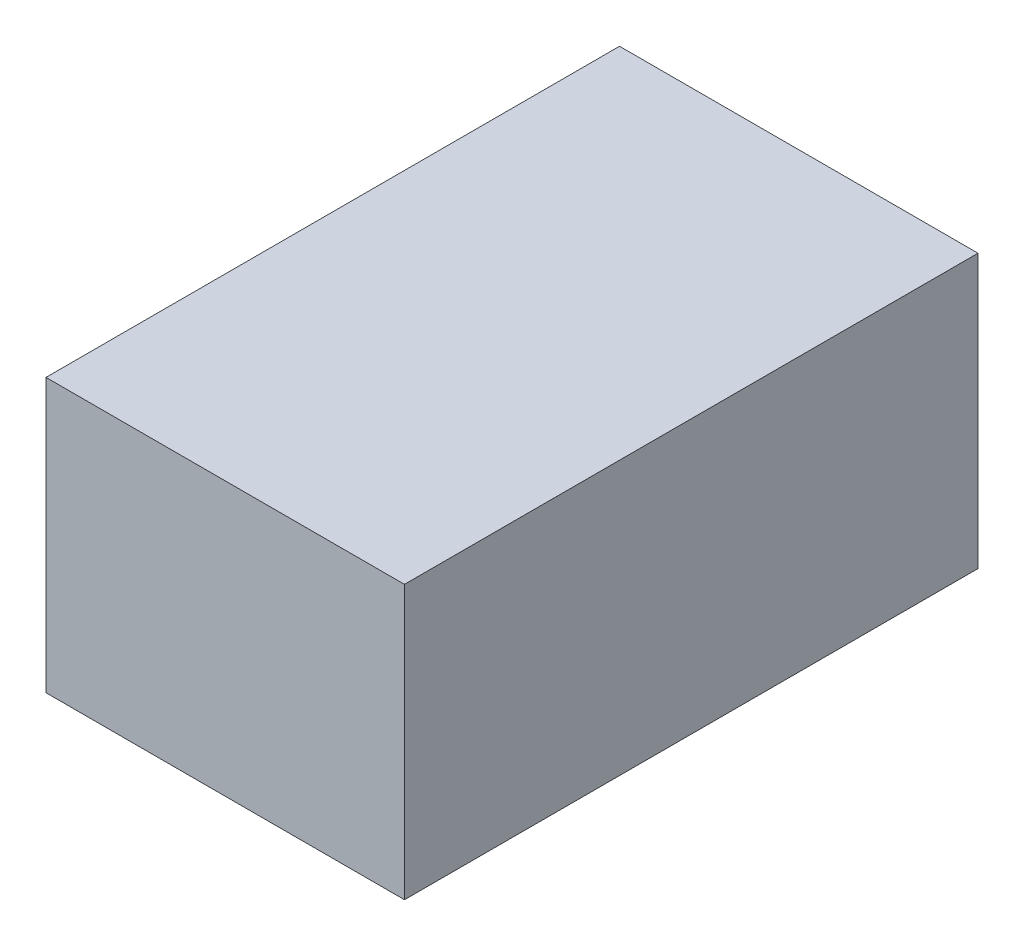
ISO-10303-21;
HEADER;
FILE_DESCRIPTION(('STEP AP214'),'2;1');
FILE_NAME('part.step','',(''),(''),'','','');
FILE_SCHEMA(('AUTOMOTIVE_DESIGN { 1 0 10303 214 1 1 1 1 }'));
ENDSEC;
DATA;
#1=APPLICATION_CONTEXT('core data for automotive mechanical design processes');
#2=APPLICATION_PROTOCOL_DEFINITION('international standard','automotive_design',2000,#1);
#3=PRODUCT_CONTEXT('',#1,'mechanical');
#4=PRODUCT('Part','Part','',(#3));
#5=PRODUCT_RELATED_PRODUCT_CATEGORY('part','',(#4));
#6=PRODUCT_DEFINITION_FORMATION('','',#4);
#7=PRODUCT_DEFINITION_CONTEXT('part definition',#1,'design');
#8=PRODUCT_DEFINITION('design','',#6,#7);
#9=PRODUCT_DEFINITION_SHAPE('','',#8);
#10=(LENGTH_UNIT() NAMED_UNIT(*) SI_UNIT(.MILLI.,.METRE.));
#11=(NAMED_UNIT(*) PLANE_ANGLE_UNIT() SI_UNIT($,.RADIAN.));
#12=(NAMED_UNIT(*) SI_UNIT($,.STERADIAN.) SOLID_ANGLE_UNIT());
#13=UNCERTAINTY_MEASURE_WITH_UNIT(LENGTH_MEASURE(1.E-05),#10,'distance_accuracy_value','');
#14=(GEOMETRIC_REPRESENTATION_CONTEXT(3) GLOBAL_UNCERTAINTY_ASSIGNED_CONTEXT((#13)) GLOBAL_UNIT_ASSIGNED_CONTEXT((#10,
#11,#12)) REPRESENTATION_CONTEXT('',''));
#15=CARTESIAN_POINT('',(0.,0.,0.));
#16=DIRECTION('',(0.,0.,1.));
#17=DIRECTION('',(1.,0.,0.));
#18=AXIS2_PLACEMENT_3D('',#15,#16,#17);
#19=CARTESIAN_POINT('',(0.,7.62,0.));
#20=DIRECTION('',(1.,0.,0.));
#21=DIRECTION('',(0.,0.,-1.));
#22=AXIS2_PLACEMENT_3D('',#19,#20,#21);
#23=PLANE('',#22);
#24=DIRECTION('',(0.,0.,1.));
#25=VECTOR('',#24,1.);
#26=CARTESIAN_POINT('',(0.,0.,0.));
#27=LINE('',#26,#25);
#28=CARTESIAN_POINT('',(0.,0.,-16.));
#29=VERTEX_POINT('',#28);
#30=CARTESIAN_POINT('',(0.,0.,0.));
#31=VERTEX_POINT('',#30);
#32=EDGE_CURVE('E111',#29,#31,#27,.T.);
#33=ORIENTED_EDGE('',*,*,#32,.T.);
#34=DIRECTION('',(0.,-1.,0.));
#35=VECTOR('',#34,1.);
#36=CARTESIAN_POINT('',(0.,7.62,0.));
#37=LINE('',#36,#35);
#38=CARTESIAN_POINT('',(0.,7.62,0.));
#39=VERTEX_POINT('',#38);
#40=EDGE_CURVE('E11',#39,#31,#37,.T.);
#41=ORIENTED_EDGE('',*,*,#40,.F.);
#42=DIRECTION('',(0.,0.,1.));
#43=VECTOR('',#42,1.);
#44=CARTESIAN_POINT('',(0.,7.62,0.));
#45=LINE('',#44,#43);
#46=CARTESIAN_POINT('',(0.,7.62,-16.));
#47=VERTEX_POINT('',#46);
#48=EDGE_CURVE('E95',#47,#39,#45,.T.);
#49=ORIENTED_EDGE('',*,*,#48,.F.);
#50=DIRECTION('',(0.,-1.,0.));
#51=VECTOR('',#50,1.);
#52=CARTESIAN_POINT('',(0.,7.62,-16.));
#53=LINE('',#52,#51);
#54=EDGE_CURVE('E107',#47,#29,#53,.T.);
#55=ORIENTED_EDGE('',*,*,#54,.T.);
#56=EDGE_LOOP('',(#33,#41,#49,#55));
#57=FACE_BOUND('',#56,.T.);
#58=ADVANCED_FACE('F43',(#57),#23,.F.);
#59=CARTESIAN_POINT('',(0.,7.62,0.));
#60=DIRECTION('',(0.,0.,-1.));
#61=DIRECTION('',(-1.,0.,0.));
#62=AXIS2_PLACEMENT_3D('',#59,#60,#61);
#63=PLANE('',#62);
#64=DIRECTION('',(1.,0.,0.));
#65=VECTOR('',#64,1.);
#66=CARTESIAN_POINT('',(0.,0.,0.));
#67=LINE('',#66,#65);
#68=CARTESIAN_POINT('',(10.,0.,0.));
#69=VERTEX_POINT('',#68);
#70=EDGE_CURVE('E100',#31,#69,#67,.T.);
#71=ORIENTED_EDGE('',*,*,#70,.T.);
#72=DIRECTION('',(0.,-1.,0.));
#73=VECTOR('',#72,1.);
#74=CARTESIAN_POINT('',(10.,7.62,0.));
#75=LINE('',#74,#73);
#76=CARTESIAN_POINT('',(10.,7.62,0.));
#77=VERTEX_POINT('',#76);
#78=EDGE_CURVE('E52',#77,#69,#75,.T.);
#79=ORIENTED_EDGE('',*,*,#78,.F.);
#80=DIRECTION('',(1.,0.,0.));
#81=VECTOR('',#80,1.);
#82=CARTESIAN_POINT('',(0.,7.62,0.));
#83=LINE('',#82,#81);
#84=EDGE_CURVE('E90',#39,#77,#83,.T.);
#85=ORIENTED_EDGE('',*,*,#84,.F.);
#86=ORIENTED_EDGE('',*,*,#40,.T.);
#87=EDGE_LOOP('',(#71,#79,#85,#86));
#88=FACE_BOUND('',#87,.T.);
#89=ADVANCED_FACE('F99',(#88),#63,.F.);
#90=CARTESIAN_POINT('',(10.,7.62,0.));
#91=DIRECTION('',(-1.,0.,0.));
#92=DIRECTION('',(0.,0.,1.));
#93=AXIS2_PLACEMENT_3D('',#90,#91,#92);
#94=PLANE('',#93);
#95=DIRECTION('',(0.,0.,-1.));
#96=VECTOR('',#95,1.);
#97=CARTESIAN_POINT('',(10.,0.,0.));
#98=LINE('',#97,#96);
#99=CARTESIAN_POINT('',(10.,0.,-16.));
#100=VERTEX_POINT('',#99);
#101=EDGE_CURVE('E77',#69,#100,#98,.T.);
#102=ORIENTED_EDGE('',*,*,#101,.T.);
#103=DIRECTION('',(0.,-1.,0.));
#104=VECTOR('',#103,1.);
#105=CARTESIAN_POINT('',(10.,7.62,-16.));
#106=LINE('',#105,#104);
#107=CARTESIAN_POINT('',(10.,7.62,-16.));
#108=VERTEX_POINT('',#107);
#109=EDGE_CURVE('E102',#108,#100,#106,.T.);
#110=ORIENTED_EDGE('',*,*,#109,.F.);
#111=DIRECTION('',(0.,0.,-1.));
#112=VECTOR('',#111,1.);
#113=CARTESIAN_POINT('',(10.,7.62,0.));
#114=LINE('',#113,#112);
#115=EDGE_CURVE('E93',#77,#108,#114,.T.);
#116=ORIENTED_EDGE('',*,*,#115,.F.);
#117=ORIENTED_EDGE('',*,*,#78,.T.);
#118=EDGE_LOOP('',(#102,#110,#116,#117));
#119=FACE_BOUND('',#118,.T.);
#120=ADVANCED_FACE('F103',(#119),#94,.F.);
#121=CARTESIAN_POINT('',(0.,7.62,-16.));
#122=DIRECTION('',(0.,0.,1.));
#123=DIRECTION('',(1.,0.,0.));
#124=AXIS2_PLACEMENT_3D('',#121,#122,#123);
#125=PLANE('',#124);
#126=DIRECTION('',(-1.,0.,0.));
#127=VECTOR('',#126,1.);
#128=CARTESIAN_POINT('',(0.,0.,-16.));
#129=LINE('',#128,#127);
#130=EDGE_CURVE('E83',#100,#29,#129,.T.);
#131=ORIENTED_EDGE('',*,*,#130,.T.);
#132=ORIENTED_EDGE('',*,*,#54,.F.);
#133=DIRECTION('',(-1.,0.,0.));
#134=VECTOR('',#133,1.);
#135=CARTESIAN_POINT('',(0.,7.62,-16.));
#136=LINE('',#135,#134);
#137=EDGE_CURVE('E60',#108,#47,#136,.T.);
#138=ORIENTED_EDGE('',*,*,#137,.F.);
#139=ORIENTED_EDGE('',*,*,#109,.T.);
#140=EDGE_LOOP('',(#131,#132,#138,#139));
#141=FACE_BOUND('',#140,.T.);
#142=ADVANCED_FACE('F124',(#141),#125,.F.);
#143=CARTESIAN_POINT('',(0.,7.62,0.));
#144=DIRECTION('',(0.,-1.,0.));
#145=DIRECTION('',(0.,0.,-1.));
#146=AXIS2_PLACEMENT_3D('',#143,#144,#145);
#147=PLANE('',#146);
#148=ORIENTED_EDGE('',*,*,#48,.T.);
#149=ORIENTED_EDGE('',*,*,#84,.T.);
#150=ORIENTED_EDGE('',*,*,#115,.T.);
#151=ORIENTED_EDGE('',*,*,#137,.T.);
#152=EDGE_LOOP('',(#148,#149,#150,#151));
#153=FACE_BOUND('',#152,.T.);
#154=ADVANCED_FACE('F91',(#153),#147,.F.);
#155=CARTESIAN_POINT('',(0.,0.,0.));
#156=DIRECTION('',(0.,-1.,0.));
#157=DIRECTION('',(0.,0.,-1.));
#158=AXIS2_PLACEMENT_3D('',#155,#156,#157);
#159=PLANE('',#158);
#160=ORIENTED_EDGE('',*,*,#32,.F.);
#161=ORIENTED_EDGE('',*,*,#130,.F.);
#162=ORIENTED_EDGE('',*,*,#101,.F.);
#163=ORIENTED_EDGE('',*,*,#70,.F.);
#164=EDGE_LOOP('',(#160,#161,#162,#163));
#165=FACE_BOUND('',#164,.T.);
#166=ADVANCED_FACE('F127',(#165),#159,.T.);
#167=CLOSED_SHELL('',(#58,#89,#120,#142,#154,#166));
#168=MANIFOLD_SOLID_BREP('B2',#167);
#169=ADVANCED_BREP_SHAPE_REPRESENTATION('',(#18,#168),#14);
#170=SHAPE_DEFINITION_REPRESENTATION(#9,#169);
ENDSEC;
END-ISO-10303-21;
